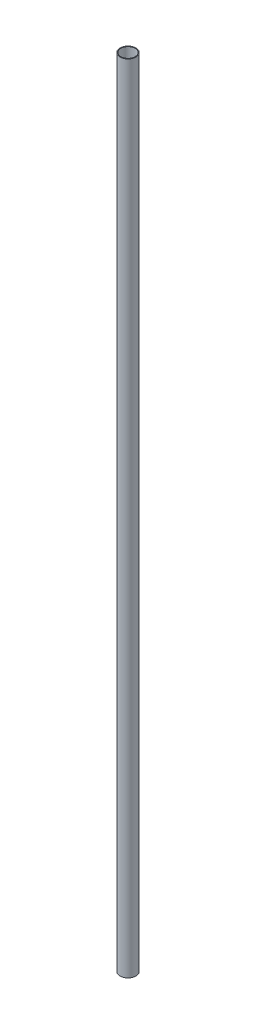
ISO-10303-21;
HEADER;
FILE_DESCRIPTION(('STEP AP214'),'2;1');
FILE_NAME('part.step','',(''),(''),'','','');
FILE_SCHEMA(('AUTOMOTIVE_DESIGN { 1 0 10303 214 1 1 1 1 }'));
ENDSEC;
DATA;
#1=APPLICATION_CONTEXT('core data for automotive mechanical design processes');
#2=APPLICATION_PROTOCOL_DEFINITION('international standard','automotive_design',2000,#1);
#3=PRODUCT_CONTEXT('',#1,'mechanical');
#4=PRODUCT('Part','Part','',(#3));
#5=PRODUCT_RELATED_PRODUCT_CATEGORY('part','',(#4));
#6=PRODUCT_DEFINITION_FORMATION('','',#4);
#7=PRODUCT_DEFINITION_CONTEXT('part definition',#1,'design');
#8=PRODUCT_DEFINITION('design','',#6,#7);
#9=PRODUCT_DEFINITION_SHAPE('','',#8);
#10=(LENGTH_UNIT() NAMED_UNIT(*) SI_UNIT(.MILLI.,.METRE.));
#11=(NAMED_UNIT(*) PLANE_ANGLE_UNIT() SI_UNIT($,.RADIAN.));
#12=(NAMED_UNIT(*) SI_UNIT($,.STERADIAN.) SOLID_ANGLE_UNIT());
#13=UNCERTAINTY_MEASURE_WITH_UNIT(LENGTH_MEASURE(1.E-05),#10,'distance_accuracy_value','');
#14=(GEOMETRIC_REPRESENTATION_CONTEXT(3) GLOBAL_UNCERTAINTY_ASSIGNED_CONTEXT((#13)) GLOBAL_UNIT_ASSIGNED_CONTEXT((#10,
#11,#12)) REPRESENTATION_CONTEXT('',''));
#15=CARTESIAN_POINT('',(0.,0.,0.));
#16=DIRECTION('',(0.,0.,1.));
#17=DIRECTION('',(1.,0.,0.));
#18=AXIS2_PLACEMENT_3D('',#15,#16,#17);
#19=CARTESIAN_POINT('',(0.,1000.,0.));
#20=DIRECTION('',(0.,1.,0.));
#21=DIRECTION('',(0.,0.,1.));
#22=AXIS2_PLACEMENT_3D('',#19,#20,#21);
#23=PLANE('',#22);
#24=CARTESIAN_POINT('',(0.,1000.,0.));
#25=DIRECTION('',(0.,1.,0.));
#26=DIRECTION('',(0.,0.,1.));
#27=AXIS2_PLACEMENT_3D('',#24,#25,#26);
#28=CIRCLE('',#27,10.);
#29=CARTESIAN_POINT('',(0.,1000.,10.));
#30=VERTEX_POINT('',#29);
#31=EDGE_CURVE('E10',#30,#30,#28,.T.);
#32=ORIENTED_EDGE('',*,*,#31,.T.);
#33=EDGE_LOOP('',(#32));
#34=FACE_BOUND('',#33,.T.);
#35=CARTESIAN_POINT('',(0.,1000.,0.));
#36=DIRECTION('',(0.,1.,0.));
#37=DIRECTION('',(0.,0.,1.));
#38=AXIS2_PLACEMENT_3D('',#35,#36,#37);
#39=CIRCLE('',#38,9.);
#40=CARTESIAN_POINT('',(0.,1000.,9.));
#41=VERTEX_POINT('',#40);
#42=EDGE_CURVE('E50',#41,#41,#39,.T.);
#43=ORIENTED_EDGE('',*,*,#42,.F.);
#44=EDGE_LOOP('',(#43));
#45=FACE_BOUND('',#44,.T.);
#46=ADVANCED_FACE('F37',(#34,#45),#23,.T.);
#47=CARTESIAN_POINT('',(0.,0.,0.));
#48=DIRECTION('',(0.,1.,0.));
#49=DIRECTION('',(0.,0.,1.));
#50=AXIS2_PLACEMENT_3D('',#47,#48,#49);
#51=PLANE('',#50);
#52=CARTESIAN_POINT('',(0.,0.,0.));
#53=DIRECTION('',(0.,1.,0.));
#54=DIRECTION('',(0.,0.,1.));
#55=AXIS2_PLACEMENT_3D('',#52,#53,#54);
#56=CIRCLE('',#55,10.);
#57=CARTESIAN_POINT('',(0.,0.,10.));
#58=VERTEX_POINT('',#57);
#59=EDGE_CURVE('E41',#58,#58,#56,.T.);
#60=ORIENTED_EDGE('',*,*,#59,.F.);
#61=EDGE_LOOP('',(#60));
#62=FACE_BOUND('',#61,.T.);
#63=CARTESIAN_POINT('',(0.,0.,0.));
#64=DIRECTION('',(0.,1.,0.));
#65=DIRECTION('',(0.,0.,1.));
#66=AXIS2_PLACEMENT_3D('',#63,#64,#65);
#67=CIRCLE('',#66,9.);
#68=CARTESIAN_POINT('',(0.,0.,9.));
#69=VERTEX_POINT('',#68);
#70=EDGE_CURVE('E52',#69,#69,#67,.T.);
#71=ORIENTED_EDGE('',*,*,#70,.T.);
#72=EDGE_LOOP('',(#71));
#73=FACE_BOUND('',#72,.T.);
#74=ADVANCED_FACE('F64',(#62,#73),#51,.F.);
#75=CARTESIAN_POINT('',(0.,1000.,0.));
#76=DIRECTION('',(0.,-1.,0.));
#77=DIRECTION('',(0.,0.,-1.));
#78=AXIS2_PLACEMENT_3D('',#75,#76,#77);
#79=CYLINDRICAL_SURFACE('',#78,10.);
#80=ORIENTED_EDGE('',*,*,#31,.F.);
#81=EDGE_LOOP('',(#80));
#82=FACE_BOUND('',#81,.T.);
#83=ORIENTED_EDGE('',*,*,#59,.T.);
#84=EDGE_LOOP('',(#83));
#85=FACE_BOUND('',#84,.T.);
#86=ADVANCED_FACE('F39',(#82,#85),#79,.T.);
#87=CARTESIAN_POINT('',(0.,1000.,0.));
#88=DIRECTION('',(0.,-1.,0.));
#89=DIRECTION('',(0.,0.,-1.));
#90=AXIS2_PLACEMENT_3D('',#87,#88,#89);
#91=CYLINDRICAL_SURFACE('',#90,9.);
#92=ORIENTED_EDGE('',*,*,#42,.T.);
#93=EDGE_LOOP('',(#92));
#94=FACE_BOUND('',#93,.T.);
#95=ORIENTED_EDGE('',*,*,#70,.F.);
#96=EDGE_LOOP('',(#95));
#97=FACE_BOUND('',#96,.T.);
#98=ADVANCED_FACE('F60',(#94,#97),#91,.F.);
#99=CLOSED_SHELL('',(#46,#74,#86,#98));
#100=MANIFOLD_SOLID_BREP('B2',#99);
#101=ADVANCED_BREP_SHAPE_REPRESENTATION('',(#18,#100),#14);
#102=SHAPE_DEFINITION_REPRESENTATION(#9,#101);
ENDSEC;
END-ISO-10303-21;
